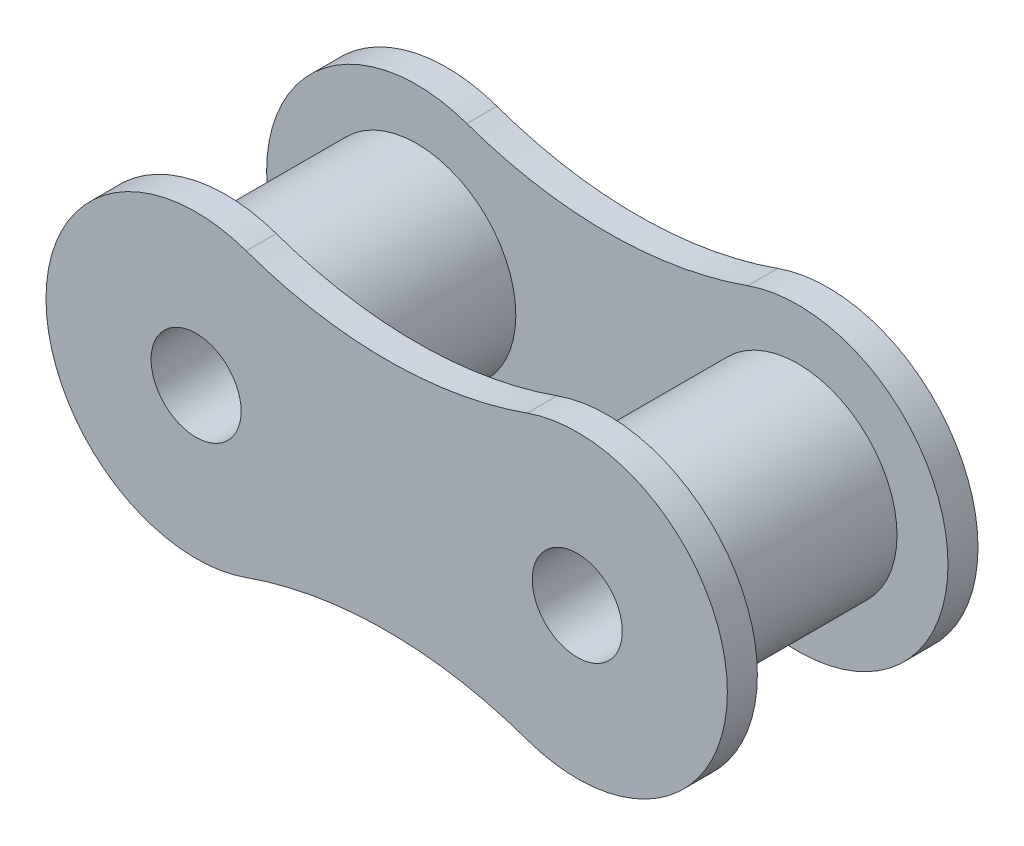
ISO-10303-21;
HEADER;
FILE_DESCRIPTION(('STEP AP214'),'2;1');
FILE_NAME('part.step','',(''),(''),'','','');
FILE_SCHEMA(('AUTOMOTIVE_DESIGN { 1 0 10303 214 1 1 1 1 }'));
ENDSEC;
DATA;
#1=APPLICATION_CONTEXT('core data for automotive mechanical design processes');
#2=APPLICATION_PROTOCOL_DEFINITION('international standard','automotive_design',2000,#1);
#3=PRODUCT_CONTEXT('',#1,'mechanical');
#4=PRODUCT('Part','Part','',(#3));
#5=PRODUCT_RELATED_PRODUCT_CATEGORY('part','',(#4));
#6=PRODUCT_DEFINITION_FORMATION('','',#4);
#7=PRODUCT_DEFINITION_CONTEXT('part definition',#1,'design');
#8=PRODUCT_DEFINITION('design','',#6,#7);
#9=PRODUCT_DEFINITION_SHAPE('','',#8);
#10=(LENGTH_UNIT() NAMED_UNIT(*) SI_UNIT(.MILLI.,.METRE.));
#11=(NAMED_UNIT(*) PLANE_ANGLE_UNIT() SI_UNIT($,.RADIAN.));
#12=(NAMED_UNIT(*) SI_UNIT($,.STERADIAN.) SOLID_ANGLE_UNIT());
#13=UNCERTAINTY_MEASURE_WITH_UNIT(LENGTH_MEASURE(1.E-05),#10,'distance_accuracy_value','');
#14=(GEOMETRIC_REPRESENTATION_CONTEXT(3) GLOBAL_UNCERTAINTY_ASSIGNED_CONTEXT((#13)) GLOBAL_UNIT_ASSIGNED_CONTEXT((#10,
#11,#12)) REPRESENTATION_CONTEXT('',''));
#15=CARTESIAN_POINT('',(0.,0.,0.));
#16=DIRECTION('',(0.,0.,1.));
#17=DIRECTION('',(1.,0.,0.));
#18=AXIS2_PLACEMENT_3D('',#15,#16,#17);
#19=CARTESIAN_POINT('',(4.7625,4.47686762703567,0.5));
#20=DIRECTION('',(0.,0.,1.));
#21=DIRECTION('',(1.,0.,0.));
#22=AXIS2_PLACEMENT_3D('',#19,#20,#21);
#23=PLANE('',#22);
#24=CARTESIAN_POINT('',(0.,0.,0.5));
#25=DIRECTION('',(0.,0.,1.));
#26=DIRECTION('',(1.,0.,0.));
#27=AXIS2_PLACEMENT_3D('',#24,#25,#26);
#28=CIRCLE('',#27,1.651);
#29=CARTESIAN_POINT('',(1.651,0.,0.5));
#30=VERTEX_POINT('',#29);
#31=EDGE_CURVE('E129',#30,#30,#28,.T.);
#32=ORIENTED_EDGE('',*,*,#31,.F.);
#33=EDGE_LOOP('',(#32));
#34=FACE_BOUND('',#33,.T.);
#35=CARTESIAN_POINT('',(6.35,0.,0.5));
#36=DIRECTION('',(0.,0.,1.));
#37=DIRECTION('',(1.,0.,0.));
#38=AXIS2_PLACEMENT_3D('',#35,#36,#37);
#39=CIRCLE('',#38,1.651);
#40=CARTESIAN_POINT('',(8.001,0.,0.5));
#41=VERTEX_POINT('',#40);
#42=EDGE_CURVE('E167',#41,#41,#39,.T.);
#43=ORIENTED_EDGE('',*,*,#42,.F.);
#44=EDGE_LOOP('',(#43));
#45=FACE_BOUND('',#44,.T.);
#46=CARTESIAN_POINT('',(3.175,8.95373525407134,0.5));
#47=DIRECTION('',(0.,0.,-1.));
#48=DIRECTION('',(1.,0.,0.));
#49=AXIS2_PLACEMENT_3D('',#46,#47,#48);
#50=CIRCLE('',#49,7.);
#51=CARTESIAN_POINT('',(5.51447368421052,2.35624611949246,0.5));
#52=VERTEX_POINT('',#51);
#53=CARTESIAN_POINT('',(0.835526315789474,2.35624611949246,0.5));
#54=VERTEX_POINT('',#53);
#55=EDGE_CURVE('E182',#52,#54,#50,.T.);
#56=ORIENTED_EDGE('',*,*,#55,.T.);
#57=CARTESIAN_POINT('',(0.,0.,0.5));
#58=DIRECTION('',(0.,0.,1.));
#59=DIRECTION('',(1.,0.,0.));
#60=AXIS2_PLACEMENT_3D('',#57,#58,#59);
#61=CIRCLE('',#60,2.5);
#62=CARTESIAN_POINT('',(0.835526315789474,-2.35624611949246,0.5));
#63=VERTEX_POINT('',#62);
#64=EDGE_CURVE('E91',#54,#63,#61,.T.);
#65=ORIENTED_EDGE('',*,*,#64,.T.);
#66=CARTESIAN_POINT('',(3.175,-8.95373525407134,0.5));
#67=DIRECTION('',(0.,0.,-1.));
#68=DIRECTION('',(-1.,0.,0.));
#69=AXIS2_PLACEMENT_3D('',#66,#67,#68);
#70=CIRCLE('',#69,7.);
#71=CARTESIAN_POINT('',(5.51447368421052,-2.35624611949246,0.5));
#72=VERTEX_POINT('',#71);
#73=EDGE_CURVE('E185',#63,#72,#70,.T.);
#74=ORIENTED_EDGE('',*,*,#73,.T.);
#75=CARTESIAN_POINT('',(6.35,0.,0.5));
#76=DIRECTION('',(0.,0.,1.));
#77=DIRECTION('',(-1.,0.,0.));
#78=AXIS2_PLACEMENT_3D('',#75,#76,#77);
#79=CIRCLE('',#78,2.5);
#80=EDGE_CURVE('E60',#72,#52,#79,.T.);
#81=ORIENTED_EDGE('',*,*,#80,.T.);
#82=EDGE_LOOP('',(#56,#65,#74,#81));
#83=FACE_BOUND('',#82,.T.);
#84=ADVANCED_FACE('F43',(#34,#45,#83),#23,.T.);
#85=CARTESIAN_POINT('',(4.7625,4.47686762703567,0.));
#86=DIRECTION('',(0.,0.,1.));
#87=DIRECTION('',(1.,0.,0.));
#88=AXIS2_PLACEMENT_3D('',#85,#86,#87);
#89=PLANE('',#88);
#90=CARTESIAN_POINT('',(3.175,8.95373525407134,0.));
#91=DIRECTION('',(0.,0.,-1.));
#92=DIRECTION('',(1.,0.,0.));
#93=AXIS2_PLACEMENT_3D('',#90,#91,#92);
#94=CIRCLE('',#93,7.);
#95=CARTESIAN_POINT('',(5.51447368421052,2.35624611949246,0.));
#96=VERTEX_POINT('',#95);
#97=CARTESIAN_POINT('',(0.835526315789474,2.35624611949246,0.));
#98=VERTEX_POINT('',#97);
#99=EDGE_CURVE('E181',#96,#98,#94,.T.);
#100=ORIENTED_EDGE('',*,*,#99,.F.);
#101=CARTESIAN_POINT('',(6.35,0.,0.));
#102=DIRECTION('',(0.,0.,1.));
#103=DIRECTION('',(-1.,0.,0.));
#104=AXIS2_PLACEMENT_3D('',#101,#102,#103);
#105=CIRCLE('',#104,2.5);
#106=CARTESIAN_POINT('',(5.51447368421052,-2.35624611949246,0.));
#107=VERTEX_POINT('',#106);
#108=EDGE_CURVE('E84',#107,#96,#105,.T.);
#109=ORIENTED_EDGE('',*,*,#108,.F.);
#110=CARTESIAN_POINT('',(3.175,-8.95373525407134,0.));
#111=DIRECTION('',(0.,0.,-1.));
#112=DIRECTION('',(-1.,0.,0.));
#113=AXIS2_PLACEMENT_3D('',#110,#111,#112);
#114=CIRCLE('',#113,7.);
#115=CARTESIAN_POINT('',(0.835526315789474,-2.35624611949246,0.));
#116=VERTEX_POINT('',#115);
#117=EDGE_CURVE('E78',#116,#107,#114,.T.);
#118=ORIENTED_EDGE('',*,*,#117,.F.);
#119=CARTESIAN_POINT('',(0.,0.,0.));
#120=DIRECTION('',(0.,0.,1.));
#121=DIRECTION('',(1.,0.,0.));
#122=AXIS2_PLACEMENT_3D('',#119,#120,#121);
#123=CIRCLE('',#122,2.5);
#124=EDGE_CURVE('E191',#98,#116,#123,.T.);
#125=ORIENTED_EDGE('',*,*,#124,.F.);
#126=EDGE_LOOP('',(#100,#109,#118,#125));
#127=FACE_BOUND('',#126,.T.);
#128=CARTESIAN_POINT('',(0.,0.,0.));
#129=DIRECTION('',(0.,0.,1.));
#130=DIRECTION('',(1.,0.,0.));
#131=AXIS2_PLACEMENT_3D('',#128,#129,#130);
#132=CIRCLE('',#131,0.75);
#133=CARTESIAN_POINT('',(0.75,0.,0.));
#134=VERTEX_POINT('',#133);
#135=EDGE_CURVE('E178',#134,#134,#132,.T.);
#136=ORIENTED_EDGE('',*,*,#135,.T.);
#137=EDGE_LOOP('',(#136));
#138=FACE_BOUND('',#137,.T.);
#139=CARTESIAN_POINT('',(6.35,0.,0.));
#140=DIRECTION('',(0.,0.,1.));
#141=DIRECTION('',(-1.,0.,0.));
#142=AXIS2_PLACEMENT_3D('',#139,#140,#141);
#143=CIRCLE('',#142,0.749999999999999);
#144=CARTESIAN_POINT('',(5.6,0.,0.));
#145=VERTEX_POINT('',#144);
#146=EDGE_CURVE('E173',#145,#145,#143,.T.);
#147=ORIENTED_EDGE('',*,*,#146,.T.);
#148=EDGE_LOOP('',(#147));
#149=FACE_BOUND('',#148,.T.);
#150=ADVANCED_FACE('F201',(#127,#138,#149),#89,.F.);
#151=CARTESIAN_POINT('',(3.175,8.95373525407134,0.5));
#152=DIRECTION('',(0.,0.,-1.));
#153=DIRECTION('',(-1.,0.,0.));
#154=AXIS2_PLACEMENT_3D('',#151,#152,#153);
#155=CYLINDRICAL_SURFACE('',#154,7.);
#156=ORIENTED_EDGE('',*,*,#99,.T.);
#157=DIRECTION('',(0.,0.,-1.));
#158=VECTOR('',#157,1.);
#159=CARTESIAN_POINT('',(0.835526315789474,2.35624611949246,0.5));
#160=LINE('',#159,#158);
#161=EDGE_CURVE('E11',#54,#98,#160,.T.);
#162=ORIENTED_EDGE('',*,*,#161,.F.);
#163=ORIENTED_EDGE('',*,*,#55,.F.);
#164=DIRECTION('',(0.,0.,-1.));
#165=VECTOR('',#164,1.);
#166=CARTESIAN_POINT('',(5.51447368421052,2.35624611949246,0.5));
#167=LINE('',#166,#165);
#168=EDGE_CURVE('E188',#52,#96,#167,.T.);
#169=ORIENTED_EDGE('',*,*,#168,.T.);
#170=EDGE_LOOP('',(#156,#162,#163,#169));
#171=FACE_BOUND('',#170,.T.);
#172=ADVANCED_FACE('F45',(#171),#155,.F.);
#173=CARTESIAN_POINT('',(0.,0.,0.5));
#174=DIRECTION('',(0.,0.,-1.));
#175=DIRECTION('',(-1.,0.,0.));
#176=AXIS2_PLACEMENT_3D('',#173,#174,#175);
#177=CYLINDRICAL_SURFACE('',#176,2.5);
#178=ORIENTED_EDGE('',*,*,#124,.T.);
#179=DIRECTION('',(0.,0.,-1.));
#180=VECTOR('',#179,1.);
#181=CARTESIAN_POINT('',(0.835526315789474,-2.35624611949246,0.5));
#182=LINE('',#181,#180);
#183=EDGE_CURVE('E52',#63,#116,#182,.T.);
#184=ORIENTED_EDGE('',*,*,#183,.F.);
#185=ORIENTED_EDGE('',*,*,#64,.F.);
#186=ORIENTED_EDGE('',*,*,#161,.T.);
#187=EDGE_LOOP('',(#178,#184,#185,#186));
#188=FACE_BOUND('',#187,.T.);
#189=ADVANCED_FACE('F219',(#188),#177,.T.);
#190=CARTESIAN_POINT('',(3.175,-8.95373525407134,0.5));
#191=DIRECTION('',(0.,0.,-1.));
#192=DIRECTION('',(-1.,0.,0.));
#193=AXIS2_PLACEMENT_3D('',#190,#191,#192);
#194=CYLINDRICAL_SURFACE('',#193,7.);
#195=ORIENTED_EDGE('',*,*,#117,.T.);
#196=DIRECTION('',(0.,0.,-1.));
#197=VECTOR('',#196,1.);
#198=CARTESIAN_POINT('',(5.51447368421052,-2.35624611949246,0.5));
#199=LINE('',#198,#197);
#200=EDGE_CURVE('E196',#72,#107,#199,.T.);
#201=ORIENTED_EDGE('',*,*,#200,.F.);
#202=ORIENTED_EDGE('',*,*,#73,.F.);
#203=ORIENTED_EDGE('',*,*,#183,.T.);
#204=EDGE_LOOP('',(#195,#201,#202,#203));
#205=FACE_BOUND('',#204,.T.);
#206=ADVANCED_FACE('F198',(#205),#194,.F.);
#207=CARTESIAN_POINT('',(6.35,0.,0.5));
#208=DIRECTION('',(0.,0.,-1.));
#209=DIRECTION('',(-1.,0.,0.));
#210=AXIS2_PLACEMENT_3D('',#207,#208,#209);
#211=CYLINDRICAL_SURFACE('',#210,2.5);
#212=ORIENTED_EDGE('',*,*,#108,.T.);
#213=ORIENTED_EDGE('',*,*,#168,.F.);
#214=ORIENTED_EDGE('',*,*,#80,.F.);
#215=ORIENTED_EDGE('',*,*,#200,.T.);
#216=EDGE_LOOP('',(#212,#213,#214,#215));
#217=FACE_BOUND('',#216,.T.);
#218=ADVANCED_FACE('F206',(#217),#211,.T.);
#219=CARTESIAN_POINT('',(0.,0.,0.5));
#220=DIRECTION('',(0.,0.,-1.));
#221=DIRECTION('',(-1.,0.,0.));
#222=AXIS2_PLACEMENT_3D('',#219,#220,#221);
#223=CYLINDRICAL_SURFACE('',#222,0.75);
#224=ORIENTED_EDGE('',*,*,#135,.F.);
#225=EDGE_LOOP('',(#224));
#226=FACE_BOUND('',#225,.T.);
#227=CARTESIAN_POINT('',(0.,0.,4.175));
#228=DIRECTION('',(0.,0.,1.));
#229=DIRECTION('',(1.,0.,0.));
#230=AXIS2_PLACEMENT_3D('',#227,#228,#229);
#231=CIRCLE('',#230,0.75);
#232=CARTESIAN_POINT('',(0.75,0.,4.175));
#233=VERTEX_POINT('',#232);
#234=EDGE_CURVE('E149',#233,#233,#231,.T.);
#235=ORIENTED_EDGE('',*,*,#234,.T.);
#236=EDGE_LOOP('',(#235));
#237=FACE_BOUND('',#236,.T.);
#238=ADVANCED_FACE('F208',(#226,#237),#223,.F.);
#239=CARTESIAN_POINT('',(6.35,0.,0.5));
#240=DIRECTION('',(0.,0.,-1.));
#241=DIRECTION('',(-1.,0.,0.));
#242=AXIS2_PLACEMENT_3D('',#239,#240,#241);
#243=CYLINDRICAL_SURFACE('',#242,0.749999999999999);
#244=ORIENTED_EDGE('',*,*,#146,.F.);
#245=EDGE_LOOP('',(#244));
#246=FACE_BOUND('',#245,.T.);
#247=CARTESIAN_POINT('',(6.35,0.,4.175));
#248=DIRECTION('',(0.,0.,1.));
#249=DIRECTION('',(-1.,0.,0.));
#250=AXIS2_PLACEMENT_3D('',#247,#248,#249);
#251=CIRCLE('',#250,0.749999999999999);
#252=CARTESIAN_POINT('',(5.6,0.,4.175));
#253=VERTEX_POINT('',#252);
#254=EDGE_CURVE('E382',#253,#253,#251,.T.);
#255=ORIENTED_EDGE('',*,*,#254,.T.);
#256=EDGE_LOOP('',(#255));
#257=FACE_BOUND('',#256,.T.);
#258=ADVANCED_FACE('F215',(#246,#257),#243,.F.);
#259=CARTESIAN_POINT('',(6.35,0.,3.675));
#260=DIRECTION('',(0.,0.,-1.));
#261=DIRECTION('',(-1.,0.,0.));
#262=AXIS2_PLACEMENT_3D('',#259,#260,#261);
#263=CYLINDRICAL_SURFACE('',#262,1.651);
#264=CARTESIAN_POINT('',(6.35,0.,3.675));
#265=DIRECTION('',(0.,0.,1.));
#266=DIRECTION('',(1.,0.,0.));
#267=AXIS2_PLACEMENT_3D('',#264,#265,#266);
#268=CIRCLE('',#267,1.651);
#269=CARTESIAN_POINT('',(8.001,0.,3.675));
#270=VERTEX_POINT('',#269);
#271=EDGE_CURVE('E170',#270,#270,#268,.T.);
#272=ORIENTED_EDGE('',*,*,#271,.F.);
#273=EDGE_LOOP('',(#272));
#274=FACE_BOUND('',#273,.T.);
#275=ORIENTED_EDGE('',*,*,#42,.T.);
#276=EDGE_LOOP('',(#275));
#277=FACE_BOUND('',#276,.T.);
#278=ADVANCED_FACE('F232',(#274,#277),#263,.T.);
#279=CARTESIAN_POINT('',(0.,0.,3.675));
#280=DIRECTION('',(0.,0.,-1.));
#281=DIRECTION('',(-1.,0.,0.));
#282=AXIS2_PLACEMENT_3D('',#279,#280,#281);
#283=CYLINDRICAL_SURFACE('',#282,1.651);
#284=CARTESIAN_POINT('',(0.,0.,3.675));
#285=DIRECTION('',(0.,0.,1.));
#286=DIRECTION('',(1.,0.,0.));
#287=AXIS2_PLACEMENT_3D('',#284,#285,#286);
#288=CIRCLE('',#287,1.651);
#289=CARTESIAN_POINT('',(1.651,0.,3.675));
#290=VERTEX_POINT('',#289);
#291=EDGE_CURVE('E164',#290,#290,#288,.T.);
#292=ORIENTED_EDGE('',*,*,#291,.F.);
#293=EDGE_LOOP('',(#292));
#294=FACE_BOUND('',#293,.T.);
#295=ORIENTED_EDGE('',*,*,#31,.T.);
#296=EDGE_LOOP('',(#295));
#297=FACE_BOUND('',#296,.T.);
#298=ADVANCED_FACE('F236',(#294,#297),#283,.T.);
#299=CARTESIAN_POINT('',(4.7625,4.47686762703567,3.675));
#300=DIRECTION('',(0.,0.,-1.));
#301=DIRECTION('',(1.,0.,0.));
#302=AXIS2_PLACEMENT_3D('',#299,#300,#301);
#303=PLANE('',#302);
#304=ORIENTED_EDGE('',*,*,#291,.T.);
#305=EDGE_LOOP('',(#304));
#306=FACE_BOUND('',#305,.T.);
#307=ORIENTED_EDGE('',*,*,#271,.T.);
#308=EDGE_LOOP('',(#307));
#309=FACE_BOUND('',#308,.T.);
#310=CARTESIAN_POINT('',(3.175,8.95373525407134,3.675));
#311=DIRECTION('',(0.,0.,-1.));
#312=DIRECTION('',(1.,0.,0.));
#313=AXIS2_PLACEMENT_3D('',#310,#311,#312);
#314=CIRCLE('',#313,7.);
#315=CARTESIAN_POINT('',(5.51447368421052,2.35624611949246,3.675));
#316=VERTEX_POINT('',#315);
#317=CARTESIAN_POINT('',(0.835526315789474,2.35624611949246,3.675));
#318=VERTEX_POINT('',#317);
#319=EDGE_CURVE('E136',#316,#318,#314,.T.);
#320=ORIENTED_EDGE('',*,*,#319,.F.);
#321=CARTESIAN_POINT('',(6.35,0.,3.675));
#322=DIRECTION('',(0.,0.,1.));
#323=DIRECTION('',(-1.,0.,0.));
#324=AXIS2_PLACEMENT_3D('',#321,#322,#323);
#325=CIRCLE('',#324,2.5);
#326=CARTESIAN_POINT('',(5.51447368421052,-2.35624611949246,3.675));
#327=VERTEX_POINT('',#326);
#328=EDGE_CURVE('E153',#327,#316,#325,.T.);
#329=ORIENTED_EDGE('',*,*,#328,.F.);
#330=CARTESIAN_POINT('',(3.175,-8.95373525407134,3.675));
#331=DIRECTION('',(0.,0.,-1.));
#332=DIRECTION('',(-1.,0.,0.));
#333=AXIS2_PLACEMENT_3D('',#330,#331,#332);
#334=CIRCLE('',#333,7.);
#335=CARTESIAN_POINT('',(0.835526315789474,-2.35624611949246,3.675));
#336=VERTEX_POINT('',#335);
#337=EDGE_CURVE('E138',#336,#327,#334,.T.);
#338=ORIENTED_EDGE('',*,*,#337,.F.);
#339=CARTESIAN_POINT('',(0.,0.,3.675));
#340=DIRECTION('',(0.,0.,1.));
#341=DIRECTION('',(1.,0.,0.));
#342=AXIS2_PLACEMENT_3D('',#339,#340,#341);
#343=CIRCLE('',#342,2.5);
#344=EDGE_CURVE('E121',#318,#336,#343,.T.);
#345=ORIENTED_EDGE('',*,*,#344,.F.);
#346=EDGE_LOOP('',(#320,#329,#338,#345));
#347=FACE_BOUND('',#346,.T.);
#348=ADVANCED_FACE('F134',(#306,#309,#347),#303,.T.);
#349=CARTESIAN_POINT('',(4.7625,4.47686762703567,4.175));
#350=DIRECTION('',(0.,0.,-1.));
#351=DIRECTION('',(1.,0.,0.));
#352=AXIS2_PLACEMENT_3D('',#349,#350,#351);
#353=PLANE('',#352);
#354=CARTESIAN_POINT('',(3.175,8.95373525407134,4.175));
#355=DIRECTION('',(0.,0.,-1.));
#356=DIRECTION('',(1.,0.,0.));
#357=AXIS2_PLACEMENT_3D('',#354,#355,#356);
#358=CIRCLE('',#357,7.);
#359=CARTESIAN_POINT('',(5.51447368421052,2.35624611949246,4.175));
#360=VERTEX_POINT('',#359);
#361=CARTESIAN_POINT('',(0.835526315789474,2.35624611949246,4.175));
#362=VERTEX_POINT('',#361);
#363=EDGE_CURVE('E155',#360,#362,#358,.T.);
#364=ORIENTED_EDGE('',*,*,#363,.T.);
#365=CARTESIAN_POINT('',(0.,0.,4.175));
#366=DIRECTION('',(0.,0.,1.));
#367=DIRECTION('',(1.,0.,0.));
#368=AXIS2_PLACEMENT_3D('',#365,#366,#367);
#369=CIRCLE('',#368,2.5);
#370=CARTESIAN_POINT('',(0.835526315789474,-2.35624611949246,4.175));
#371=VERTEX_POINT('',#370);
#372=EDGE_CURVE('E124',#362,#371,#369,.T.);
#373=ORIENTED_EDGE('',*,*,#372,.T.);
#374=CARTESIAN_POINT('',(3.175,-8.95373525407134,4.175));
#375=DIRECTION('',(0.,0.,-1.));
#376=DIRECTION('',(-1.,0.,0.));
#377=AXIS2_PLACEMENT_3D('',#374,#375,#376);
#378=CIRCLE('',#377,7.);
#379=CARTESIAN_POINT('',(5.51447368421052,-2.35624611949246,4.175));
#380=VERTEX_POINT('',#379);
#381=EDGE_CURVE('E146',#371,#380,#378,.T.);
#382=ORIENTED_EDGE('',*,*,#381,.T.);
#383=CARTESIAN_POINT('',(6.35,0.,4.175));
#384=DIRECTION('',(0.,0.,1.));
#385=DIRECTION('',(-1.,0.,0.));
#386=AXIS2_PLACEMENT_3D('',#383,#384,#385);
#387=CIRCLE('',#386,2.5);
#388=EDGE_CURVE('E143',#380,#360,#387,.T.);
#389=ORIENTED_EDGE('',*,*,#388,.T.);
#390=EDGE_LOOP('',(#364,#373,#382,#389));
#391=FACE_BOUND('',#390,.T.);
#392=ORIENTED_EDGE('',*,*,#234,.F.);
#393=EDGE_LOOP('',(#392));
#394=FACE_BOUND('',#393,.T.);
#395=ORIENTED_EDGE('',*,*,#254,.F.);
#396=EDGE_LOOP('',(#395));
#397=FACE_BOUND('',#396,.T.);
#398=ADVANCED_FACE('F243',(#391,#394,#397),#353,.F.);
#399=CARTESIAN_POINT('',(3.175,8.95373525407134,3.675));
#400=DIRECTION('',(0.,0.,1.));
#401=DIRECTION('',(-1.,0.,0.));
#402=AXIS2_PLACEMENT_3D('',#399,#400,#401);
#403=CYLINDRICAL_SURFACE('',#402,7.);
#404=ORIENTED_EDGE('',*,*,#363,.F.);
#405=DIRECTION('',(0.,0.,1.));
#406=VECTOR('',#405,1.);
#407=CARTESIAN_POINT('',(5.51447368421052,2.35624611949246,3.675));
#408=LINE('',#407,#406);
#409=EDGE_CURVE('E141',#316,#360,#408,.T.);
#410=ORIENTED_EDGE('',*,*,#409,.F.);
#411=ORIENTED_EDGE('',*,*,#319,.T.);
#412=DIRECTION('',(0.,0.,1.));
#413=VECTOR('',#412,1.);
#414=CARTESIAN_POINT('',(0.835526315789474,2.35624611949246,3.675));
#415=LINE('',#414,#413);
#416=EDGE_CURVE('E118',#318,#362,#415,.T.);
#417=ORIENTED_EDGE('',*,*,#416,.T.);
#418=EDGE_LOOP('',(#404,#410,#411,#417));
#419=FACE_BOUND('',#418,.T.);
#420=ADVANCED_FACE('F140',(#419),#403,.F.);
#421=CARTESIAN_POINT('',(0.,0.,3.675));
#422=DIRECTION('',(0.,0.,1.));
#423=DIRECTION('',(-1.,0.,0.));
#424=AXIS2_PLACEMENT_3D('',#421,#422,#423);
#425=CYLINDRICAL_SURFACE('',#424,2.5);
#426=ORIENTED_EDGE('',*,*,#372,.F.);
#427=ORIENTED_EDGE('',*,*,#416,.F.);
#428=ORIENTED_EDGE('',*,*,#344,.T.);
#429=DIRECTION('',(0.,0.,1.));
#430=VECTOR('',#429,1.);
#431=CARTESIAN_POINT('',(0.835526315789474,-2.35624611949246,3.675));
#432=LINE('',#431,#430);
#433=EDGE_CURVE('E130',#336,#371,#432,.T.);
#434=ORIENTED_EDGE('',*,*,#433,.T.);
#435=EDGE_LOOP('',(#426,#427,#428,#434));
#436=FACE_BOUND('',#435,.T.);
#437=ADVANCED_FACE('F120',(#436),#425,.T.);
#438=CARTESIAN_POINT('',(3.175,-8.95373525407134,3.675));
#439=DIRECTION('',(0.,0.,1.));
#440=DIRECTION('',(-1.,0.,0.));
#441=AXIS2_PLACEMENT_3D('',#438,#439,#440);
#442=CYLINDRICAL_SURFACE('',#441,7.);
#443=ORIENTED_EDGE('',*,*,#381,.F.);
#444=ORIENTED_EDGE('',*,*,#433,.F.);
#445=ORIENTED_EDGE('',*,*,#337,.T.);
#446=DIRECTION('',(0.,0.,1.));
#447=VECTOR('',#446,1.);
#448=CARTESIAN_POINT('',(5.51447368421052,-2.35624611949246,3.675));
#449=LINE('',#448,#447);
#450=EDGE_CURVE('E161',#327,#380,#449,.T.);
#451=ORIENTED_EDGE('',*,*,#450,.T.);
#452=EDGE_LOOP('',(#443,#444,#445,#451));
#453=FACE_BOUND('',#452,.T.);
#454=ADVANCED_FACE('F246',(#453),#442,.F.);
#455=CARTESIAN_POINT('',(6.35,0.,3.675));
#456=DIRECTION('',(0.,0.,1.));
#457=DIRECTION('',(-1.,0.,0.));
#458=AXIS2_PLACEMENT_3D('',#455,#456,#457);
#459=CYLINDRICAL_SURFACE('',#458,2.5);
#460=ORIENTED_EDGE('',*,*,#388,.F.);
#461=ORIENTED_EDGE('',*,*,#450,.F.);
#462=ORIENTED_EDGE('',*,*,#328,.T.);
#463=ORIENTED_EDGE('',*,*,#409,.T.);
#464=EDGE_LOOP('',(#460,#461,#462,#463));
#465=FACE_BOUND('',#464,.T.);
#466=ADVANCED_FACE('F249',(#465),#459,.T.);
#467=CLOSED_SHELL('',(#84,#150,#172,#189,#206,#218,#238,#258,#278,#298,#348,#398,#420,#437,#454,#466));
#468=MANIFOLD_SOLID_BREP('B2',#467);
#469=ADVANCED_BREP_SHAPE_REPRESENTATION('',(#18,#468),#14);
#470=SHAPE_DEFINITION_REPRESENTATION(#9,#469);
ENDSEC;
END-ISO-10303-21;
